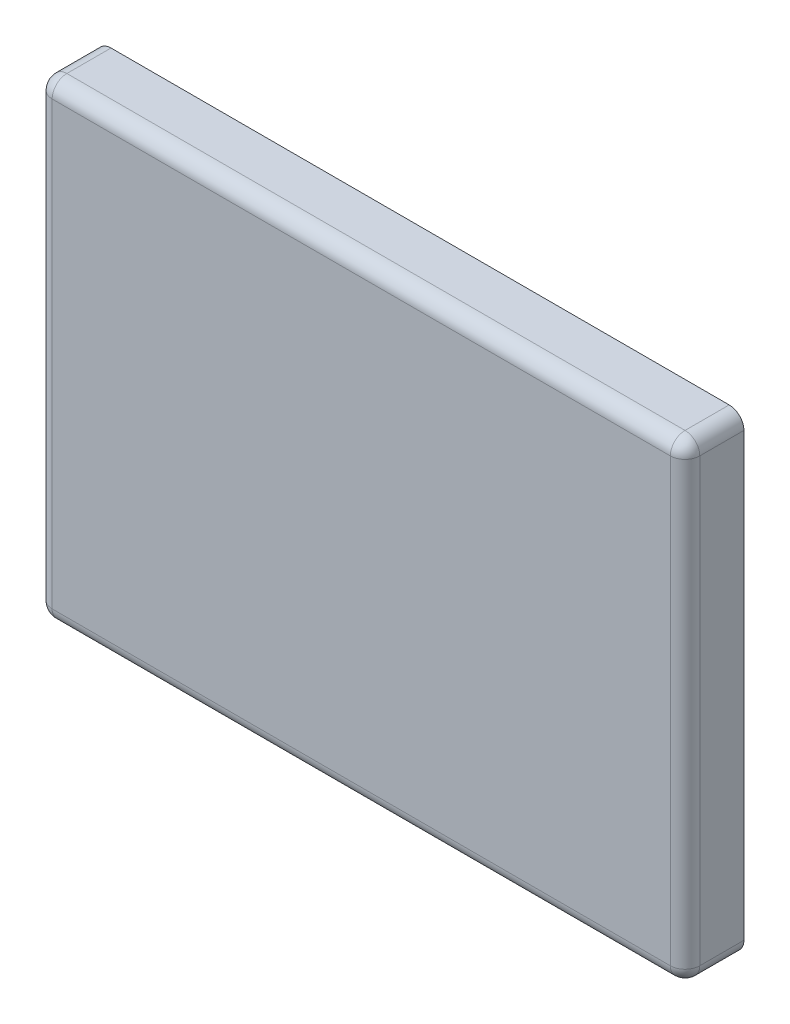
ISO-10303-21;
HEADER;
FILE_DESCRIPTION(('STEP AP214'),'2;1');
FILE_NAME('part.step','',(''),(''),'','','');
FILE_SCHEMA(('AUTOMOTIVE_DESIGN { 1 0 10303 214 1 1 1 1 }'));
ENDSEC;
DATA;
#1=APPLICATION_CONTEXT('core data for automotive mechanical design processes');
#2=APPLICATION_PROTOCOL_DEFINITION('international standard','automotive_design',2000,#1);
#3=PRODUCT_CONTEXT('',#1,'mechanical');
#4=PRODUCT('Part','Part','',(#3));
#5=PRODUCT_RELATED_PRODUCT_CATEGORY('part','',(#4));
#6=PRODUCT_DEFINITION_FORMATION('','',#4);
#7=PRODUCT_DEFINITION_CONTEXT('part definition',#1,'design');
#8=PRODUCT_DEFINITION('design','',#6,#7);
#9=PRODUCT_DEFINITION_SHAPE('','',#8);
#10=(LENGTH_UNIT() NAMED_UNIT(*) SI_UNIT(.MILLI.,.METRE.));
#11=(NAMED_UNIT(*) PLANE_ANGLE_UNIT() SI_UNIT($,.RADIAN.));
#12=(NAMED_UNIT(*) SI_UNIT($,.STERADIAN.) SOLID_ANGLE_UNIT());
#13=UNCERTAINTY_MEASURE_WITH_UNIT(LENGTH_MEASURE(1.E-05),#10,'distance_accuracy_value','');
#14=(GEOMETRIC_REPRESENTATION_CONTEXT(3) GLOBAL_UNCERTAINTY_ASSIGNED_CONTEXT((#13)) GLOBAL_UNIT_ASSIGNED_CONTEXT((#10,
#11,#12)) REPRESENTATION_CONTEXT('',''));
#15=CARTESIAN_POINT('',(0.,0.,0.));
#16=DIRECTION('',(0.,0.,1.));
#17=DIRECTION('',(1.,0.,0.));
#18=AXIS2_PLACEMENT_3D('',#15,#16,#17);
#19=CARTESIAN_POINT('',(0.,0.,0.));
#20=DIRECTION('',(0.,0.,1.));
#21=DIRECTION('',(1.,0.,0.));
#22=AXIS2_PLACEMENT_3D('',#19,#20,#21);
#23=PLANE('',#22);
#24=CARTESIAN_POINT('',(430.,-60.,0.));
#25=DIRECTION('',(0.,0.,-1.));
#26=DIRECTION('',(-1.,0.,0.));
#27=AXIS2_PLACEMENT_3D('',#24,#25,#26);
#28=CIRCLE('',#27,4.99999999999999);
#29=CARTESIAN_POINT('',(425.,-60.,0.));
#30=VERTEX_POINT('',#29);
#31=EDGE_CURVE('E494',#30,#30,#28,.T.);
#32=ORIENTED_EDGE('',*,*,#31,.F.);
#33=EDGE_LOOP('',(#32));
#34=FACE_BOUND('',#33,.T.);
#35=CARTESIAN_POINT('',(430.,-260.,0.));
#36=DIRECTION('',(0.,0.,-1.));
#37=DIRECTION('',(-1.,0.,0.));
#38=AXIS2_PLACEMENT_3D('',#35,#36,#37);
#39=CIRCLE('',#38,4.99999999999999);
#40=CARTESIAN_POINT('',(425.,-260.,0.));
#41=VERTEX_POINT('',#40);
#42=EDGE_CURVE('E501',#41,#41,#39,.T.);
#43=ORIENTED_EDGE('',*,*,#42,.F.);
#44=EDGE_LOOP('',(#43));
#45=FACE_BOUND('',#44,.T.);
#46=DIRECTION('',(1.,0.,0.));
#47=VECTOR('',#46,1.);
#48=CARTESIAN_POINT('',(0.,-320.,0.));
#49=LINE('',#48,#47);
#50=CARTESIAN_POINT('',(10.,-320.,0.));
#51=VERTEX_POINT('',#50);
#52=CARTESIAN_POINT('',(430.,-320.,0.));
#53=VERTEX_POINT('',#52);
#54=EDGE_CURVE('E185',#51,#53,#49,.T.);
#55=ORIENTED_EDGE('',*,*,#54,.F.);
#56=CARTESIAN_POINT('',(10.,-310.,0.));
#57=DIRECTION('',(0.,0.,1.));
#58=DIRECTION('',(1.,0.,0.));
#59=AXIS2_PLACEMENT_3D('',#56,#57,#58);
#60=CIRCLE('',#59,10.);
#61=CARTESIAN_POINT('',(0.,-310.,0.));
#62=VERTEX_POINT('',#61);
#63=EDGE_CURVE('E216',#51,#62,#60,.F.);
#64=ORIENTED_EDGE('',*,*,#63,.T.);
#65=DIRECTION('',(0.,-1.,0.));
#66=VECTOR('',#65,1.);
#67=CARTESIAN_POINT('',(0.,0.,0.));
#68=LINE('',#67,#66);
#69=CARTESIAN_POINT('',(0.,-10.,0.));
#70=VERTEX_POINT('',#69);
#71=EDGE_CURVE('E181',#70,#62,#68,.T.);
#72=ORIENTED_EDGE('',*,*,#71,.F.);
#73=CARTESIAN_POINT('',(10.,-10.,0.));
#74=DIRECTION('',(0.,0.,1.));
#75=DIRECTION('',(1.,0.,0.));
#76=AXIS2_PLACEMENT_3D('',#73,#74,#75);
#77=CIRCLE('',#76,10.);
#78=CARTESIAN_POINT('',(10.,0.,0.));
#79=VERTEX_POINT('',#78);
#80=EDGE_CURVE('E207',#70,#79,#77,.F.);
#81=ORIENTED_EDGE('',*,*,#80,.T.);
#82=DIRECTION('',(-1.,0.,0.));
#83=VECTOR('',#82,1.);
#84=CARTESIAN_POINT('',(0.,0.,0.));
#85=LINE('',#84,#83);
#86=CARTESIAN_POINT('',(430.,0.,0.));
#87=VERTEX_POINT('',#86);
#88=EDGE_CURVE('E193',#87,#79,#85,.T.);
#89=ORIENTED_EDGE('',*,*,#88,.F.);
#90=CARTESIAN_POINT('',(430.,-10.,0.));
#91=DIRECTION('',(0.,0.,1.));
#92=DIRECTION('',(1.,0.,0.));
#93=AXIS2_PLACEMENT_3D('',#90,#91,#92);
#94=CIRCLE('',#93,10.);
#95=CARTESIAN_POINT('',(440.,-10.,0.));
#96=VERTEX_POINT('',#95);
#97=EDGE_CURVE('E210',#87,#96,#94,.F.);
#98=ORIENTED_EDGE('',*,*,#97,.T.);
#99=DIRECTION('',(0.,1.,0.));
#100=VECTOR('',#99,1.);
#101=CARTESIAN_POINT('',(440.,0.,0.));
#102=LINE('',#101,#100);
#103=CARTESIAN_POINT('',(440.,-310.,0.));
#104=VERTEX_POINT('',#103);
#105=EDGE_CURVE('E189',#104,#96,#102,.T.);
#106=ORIENTED_EDGE('',*,*,#105,.F.);
#107=CARTESIAN_POINT('',(430.,-310.,0.));
#108=DIRECTION('',(0.,0.,1.));
#109=DIRECTION('',(1.,0.,0.));
#110=AXIS2_PLACEMENT_3D('',#107,#108,#109);
#111=CIRCLE('',#110,10.);
#112=EDGE_CURVE('E213',#104,#53,#111,.F.);
#113=ORIENTED_EDGE('',*,*,#112,.T.);
#114=EDGE_LOOP('',(#55,#64,#72,#81,#89,#98,#106,#113));
#115=FACE_BOUND('',#114,.T.);
#116=DIRECTION('',(0.,-1.,0.));
#117=VECTOR('',#116,1.);
#118=CARTESIAN_POINT('',(400.,-40.,0.));
#119=LINE('',#118,#117);
#120=CARTESIAN_POINT('',(400.,-40.,0.));
#121=VERTEX_POINT('',#120);
#122=CARTESIAN_POINT('',(400.,-280.,0.));
#123=VERTEX_POINT('',#122);
#124=EDGE_CURVE('E62',#121,#123,#119,.T.);
#125=ORIENTED_EDGE('',*,*,#124,.F.);
#126=DIRECTION('',(1.,0.,0.));
#127=VECTOR('',#126,1.);
#128=CARTESIAN_POINT('',(400.,-40.,0.));
#129=LINE('',#128,#127);
#130=CARTESIAN_POINT('',(40.,-40.,0.));
#131=VERTEX_POINT('',#130);
#132=EDGE_CURVE('E66',#131,#121,#129,.T.);
#133=ORIENTED_EDGE('',*,*,#132,.F.);
#134=DIRECTION('',(0.,1.,0.));
#135=VECTOR('',#134,1.);
#136=CARTESIAN_POINT('',(40.,-40.,0.));
#137=LINE('',#136,#135);
#138=CARTESIAN_POINT('',(39.9999999999999,-280.,0.));
#139=VERTEX_POINT('',#138);
#140=EDGE_CURVE('E518',#139,#131,#137,.T.);
#141=ORIENTED_EDGE('',*,*,#140,.F.);
#142=DIRECTION('',(-1.,0.,0.));
#143=VECTOR('',#142,1.);
#144=CARTESIAN_POINT('',(400.,-280.,0.));
#145=LINE('',#144,#143);
#146=EDGE_CURVE('E498',#123,#139,#145,.T.);
#147=ORIENTED_EDGE('',*,*,#146,.F.);
#148=EDGE_LOOP('',(#125,#133,#141,#147));
#149=FACE_BOUND('',#148,.T.);
#150=ADVANCED_FACE('F44',(#34,#45,#115,#149),#23,.F.);
#151=CARTESIAN_POINT('',(0.,0.,40.));
#152=DIRECTION('',(1.,0.,0.));
#153=DIRECTION('',(0.,1.,0.));
#154=AXIS2_PLACEMENT_3D('',#151,#152,#153);
#155=PLANE('',#154);
#156=ORIENTED_EDGE('',*,*,#71,.T.);
#157=DIRECTION('',(0.,0.,-1.));
#158=VECTOR('',#157,1.);
#159=CARTESIAN_POINT('',(0.,-310.,40.));
#160=LINE('',#159,#158);
#161=CARTESIAN_POINT('',(0.,-310.,30.));
#162=VERTEX_POINT('',#161);
#163=EDGE_CURVE('E225',#62,#162,#160,.F.);
#164=ORIENTED_EDGE('',*,*,#163,.T.);
#165=DIRECTION('',(0.,-1.,0.));
#166=VECTOR('',#165,1.);
#167=CARTESIAN_POINT('',(0.,0.,30.));
#168=LINE('',#167,#166);
#169=CARTESIAN_POINT('',(0.,-10.,30.));
#170=VERTEX_POINT('',#169);
#171=EDGE_CURVE('E222',#162,#170,#168,.F.);
#172=ORIENTED_EDGE('',*,*,#171,.T.);
#173=DIRECTION('',(0.,0.,-1.));
#174=VECTOR('',#173,1.);
#175=CARTESIAN_POINT('',(0.,-10.,40.));
#176=LINE('',#175,#174);
#177=EDGE_CURVE('E219',#170,#70,#176,.T.);
#178=ORIENTED_EDGE('',*,*,#177,.T.);
#179=EDGE_LOOP('',(#156,#164,#172,#178));
#180=FACE_BOUND('',#179,.T.);
#181=ADVANCED_FACE('F355',(#180),#155,.F.);
#182=CARTESIAN_POINT('',(0.,-320.,40.));
#183=DIRECTION('',(0.,1.,0.));
#184=DIRECTION('',(0.,0.,1.));
#185=AXIS2_PLACEMENT_3D('',#182,#183,#184);
#186=PLANE('',#185);
#187=DIRECTION('',(1.,0.,0.));
#188=VECTOR('',#187,1.);
#189=CARTESIAN_POINT('',(0.,-320.,30.));
#190=LINE('',#189,#188);
#191=CARTESIAN_POINT('',(430.,-320.,30.));
#192=VERTEX_POINT('',#191);
#193=CARTESIAN_POINT('',(10.,-320.,30.));
#194=VERTEX_POINT('',#193);
#195=EDGE_CURVE('E200',#192,#194,#190,.F.);
#196=ORIENTED_EDGE('',*,*,#195,.T.);
#197=DIRECTION('',(0.,0.,-1.));
#198=VECTOR('',#197,1.);
#199=CARTESIAN_POINT('',(10.,-320.,40.));
#200=LINE('',#199,#198);
#201=EDGE_CURVE('E203',#194,#51,#200,.T.);
#202=ORIENTED_EDGE('',*,*,#201,.T.);
#203=ORIENTED_EDGE('',*,*,#54,.T.);
#204=DIRECTION('',(0.,0.,-1.));
#205=VECTOR('',#204,1.);
#206=CARTESIAN_POINT('',(430.,-320.,40.));
#207=LINE('',#206,#205);
#208=EDGE_CURVE('E197',#53,#192,#207,.F.);
#209=ORIENTED_EDGE('',*,*,#208,.T.);
#210=EDGE_LOOP('',(#196,#202,#203,#209));
#211=FACE_BOUND('',#210,.T.);
#212=ADVANCED_FACE('F346',(#211),#186,.F.);
#213=CARTESIAN_POINT('',(440.,0.,40.));
#214=DIRECTION('',(-1.,0.,0.));
#215=DIRECTION('',(0.,-1.,0.));
#216=AXIS2_PLACEMENT_3D('',#213,#214,#215);
#217=PLANE('',#216);
#218=DIRECTION('',(0.,1.,0.));
#219=VECTOR('',#218,1.);
#220=CARTESIAN_POINT('',(440.,-320.,30.));
#221=LINE('',#220,#219);
#222=CARTESIAN_POINT('',(440.,-10.,30.));
#223=VERTEX_POINT('',#222);
#224=CARTESIAN_POINT('',(440.,-310.,30.));
#225=VERTEX_POINT('',#224);
#226=EDGE_CURVE('E244',#223,#225,#221,.F.);
#227=ORIENTED_EDGE('',*,*,#226,.T.);
#228=DIRECTION('',(0.,0.,-1.));
#229=VECTOR('',#228,1.);
#230=CARTESIAN_POINT('',(440.,-310.,40.));
#231=LINE('',#230,#229);
#232=EDGE_CURVE('E247',#225,#104,#231,.T.);
#233=ORIENTED_EDGE('',*,*,#232,.T.);
#234=ORIENTED_EDGE('',*,*,#105,.T.);
#235=DIRECTION('',(0.,0.,-1.));
#236=VECTOR('',#235,1.);
#237=CARTESIAN_POINT('',(440.,-10.,40.));
#238=LINE('',#237,#236);
#239=EDGE_CURVE('E241',#96,#223,#238,.F.);
#240=ORIENTED_EDGE('',*,*,#239,.T.);
#241=EDGE_LOOP('',(#227,#233,#234,#240));
#242=FACE_BOUND('',#241,.T.);
#243=ADVANCED_FACE('F338',(#242),#217,.F.);
#244=CARTESIAN_POINT('',(0.,0.,40.));
#245=DIRECTION('',(0.,-1.,0.));
#246=DIRECTION('',(0.,0.,-1.));
#247=AXIS2_PLACEMENT_3D('',#244,#245,#246);
#248=PLANE('',#247);
#249=DIRECTION('',(-1.,0.,0.));
#250=VECTOR('',#249,1.);
#251=CARTESIAN_POINT('',(440.,0.,30.));
#252=LINE('',#251,#250);
#253=CARTESIAN_POINT('',(10.,0.,30.));
#254=VERTEX_POINT('',#253);
#255=CARTESIAN_POINT('',(430.,0.,30.));
#256=VERTEX_POINT('',#255);
#257=EDGE_CURVE('E54',#254,#256,#252,.F.);
#258=ORIENTED_EDGE('',*,*,#257,.T.);
#259=DIRECTION('',(0.,0.,-1.));
#260=VECTOR('',#259,1.);
#261=CARTESIAN_POINT('',(430.,0.,40.));
#262=LINE('',#261,#260);
#263=EDGE_CURVE('E11',#256,#87,#262,.T.);
#264=ORIENTED_EDGE('',*,*,#263,.T.);
#265=ORIENTED_EDGE('',*,*,#88,.T.);
#266=DIRECTION('',(0.,0.,-1.));
#267=VECTOR('',#266,1.);
#268=CARTESIAN_POINT('',(10.,0.,40.));
#269=LINE('',#268,#267);
#270=EDGE_CURVE('E250',#79,#254,#269,.F.);
#271=ORIENTED_EDGE('',*,*,#270,.T.);
#272=EDGE_LOOP('',(#258,#264,#265,#271));
#273=FACE_BOUND('',#272,.T.);
#274=ADVANCED_FACE('F308',(#273),#248,.F.);
#275=CARTESIAN_POINT('',(0.,0.,40.));
#276=DIRECTION('',(0.,0.,1.));
#277=DIRECTION('',(1.,0.,0.));
#278=AXIS2_PLACEMENT_3D('',#275,#276,#277);
#279=PLANE('',#278);
#280=DIRECTION('',(-1.,0.,0.));
#281=VECTOR('',#280,1.);
#282=CARTESIAN_POINT('',(0.,-10.,40.));
#283=LINE('',#282,#281);
#284=CARTESIAN_POINT('',(430.,-10.,40.));
#285=VERTEX_POINT('',#284);
#286=CARTESIAN_POINT('',(10.,-10.,40.));
#287=VERTEX_POINT('',#286);
#288=EDGE_CURVE('E228',#285,#287,#283,.T.);
#289=ORIENTED_EDGE('',*,*,#288,.T.);
#290=DIRECTION('',(0.,-1.,0.));
#291=VECTOR('',#290,1.);
#292=CARTESIAN_POINT('',(10.,-320.,40.));
#293=LINE('',#292,#291);
#294=CARTESIAN_POINT('',(10.,-310.,40.));
#295=VERTEX_POINT('',#294);
#296=EDGE_CURVE('E237',#287,#295,#293,.T.);
#297=ORIENTED_EDGE('',*,*,#296,.T.);
#298=DIRECTION('',(1.,0.,0.));
#299=VECTOR('',#298,1.);
#300=CARTESIAN_POINT('',(440.,-310.,40.));
#301=LINE('',#300,#299);
#302=CARTESIAN_POINT('',(430.,-310.,40.));
#303=VERTEX_POINT('',#302);
#304=EDGE_CURVE('E234',#295,#303,#301,.T.);
#305=ORIENTED_EDGE('',*,*,#304,.T.);
#306=DIRECTION('',(0.,1.,0.));
#307=VECTOR('',#306,1.);
#308=CARTESIAN_POINT('',(430.,0.,40.));
#309=LINE('',#308,#307);
#310=EDGE_CURVE('E231',#303,#285,#309,.T.);
#311=ORIENTED_EDGE('',*,*,#310,.T.);
#312=EDGE_LOOP('',(#289,#297,#305,#311));
#313=FACE_BOUND('',#312,.T.);
#314=ADVANCED_FACE('F331',(#313),#279,.T.);
#315=CARTESIAN_POINT('',(430.,-10.,40.));
#316=DIRECTION('',(0.,0.,-1.));
#317=DIRECTION('',(-1.,0.,0.));
#318=AXIS2_PLACEMENT_3D('',#315,#316,#317);
#319=CYLINDRICAL_SURFACE('',#318,10.);
#320=CARTESIAN_POINT('',(430.,-10.,30.));
#321=DIRECTION('',(0.,0.,1.));
#322=DIRECTION('',(1.,0.,0.));
#323=AXIS2_PLACEMENT_3D('',#320,#321,#322);
#324=CIRCLE('',#323,10.);
#325=EDGE_CURVE('E48',#223,#256,#324,.T.);
#326=ORIENTED_EDGE('',*,*,#325,.F.);
#327=ORIENTED_EDGE('',*,*,#239,.F.);
#328=ORIENTED_EDGE('',*,*,#97,.F.);
#329=ORIENTED_EDGE('',*,*,#263,.F.);
#330=EDGE_LOOP('',(#326,#327,#328,#329));
#331=FACE_BOUND('',#330,.T.);
#332=ADVANCED_FACE('F46',(#331),#319,.T.);
#333=CARTESIAN_POINT('',(430.,-10.,30.));
#334=DIRECTION('',(0.,1.,0.));
#335=DIRECTION('',(0.,0.,1.));
#336=AXIS2_PLACEMENT_3D('',#333,#334,#335);
#337=SPHERICAL_SURFACE('',#336,10.);
#338=CARTESIAN_POINT('',(430.,-10.,30.));
#339=DIRECTION('',(0.,1.,0.));
#340=DIRECTION('',(-1.,0.,0.));
#341=AXIS2_PLACEMENT_3D('',#338,#339,#340);
#342=CIRCLE('',#341,10.);
#343=EDGE_CURVE('E285',#223,#285,#342,.F.);
#344=ORIENTED_EDGE('',*,*,#343,.F.);
#345=ORIENTED_EDGE('',*,*,#325,.T.);
#346=CARTESIAN_POINT('',(430.,-10.,30.));
#347=DIRECTION('',(1.,0.,0.));
#348=DIRECTION('',(0.,0.,-1.));
#349=AXIS2_PLACEMENT_3D('',#346,#347,#348);
#350=CIRCLE('',#349,10.);
#351=EDGE_CURVE('E288',#285,#256,#350,.F.);
#352=ORIENTED_EDGE('',*,*,#351,.F.);
#353=EDGE_LOOP('',(#344,#345,#352));
#354=FACE_BOUND('',#353,.T.);
#355=ADVANCED_FACE('F300',(#354),#337,.T.);
#356=CARTESIAN_POINT('',(10.,-10.,40.));
#357=DIRECTION('',(0.,0.,-1.));
#358=DIRECTION('',(-1.,0.,0.));
#359=AXIS2_PLACEMENT_3D('',#356,#357,#358);
#360=CYLINDRICAL_SURFACE('',#359,10.);
#361=ORIENTED_EDGE('',*,*,#80,.F.);
#362=ORIENTED_EDGE('',*,*,#177,.F.);
#363=CARTESIAN_POINT('',(10.,-10.,30.));
#364=DIRECTION('',(0.,0.,1.));
#365=DIRECTION('',(1.,0.,0.));
#366=AXIS2_PLACEMENT_3D('',#363,#364,#365);
#367=CIRCLE('',#366,10.);
#368=EDGE_CURVE('E281',#254,#170,#367,.T.);
#369=ORIENTED_EDGE('',*,*,#368,.F.);
#370=ORIENTED_EDGE('',*,*,#270,.F.);
#371=EDGE_LOOP('',(#361,#362,#369,#370));
#372=FACE_BOUND('',#371,.T.);
#373=ADVANCED_FACE('F317',(#372),#360,.T.);
#374=CARTESIAN_POINT('',(0.,-10.,30.));
#375=DIRECTION('',(1.,0.,0.));
#376=DIRECTION('',(0.,0.,-1.));
#377=AXIS2_PLACEMENT_3D('',#374,#375,#376);
#378=CYLINDRICAL_SURFACE('',#377,10.);
#379=ORIENTED_EDGE('',*,*,#351,.T.);
#380=ORIENTED_EDGE('',*,*,#257,.F.);
#381=CARTESIAN_POINT('',(10.,-10.,30.));
#382=DIRECTION('',(-1.,0.,0.));
#383=DIRECTION('',(0.,0.,1.));
#384=AXIS2_PLACEMENT_3D('',#381,#382,#383);
#385=CIRCLE('',#384,10.);
#386=EDGE_CURVE('E277',#287,#254,#385,.T.);
#387=ORIENTED_EDGE('',*,*,#386,.F.);
#388=ORIENTED_EDGE('',*,*,#288,.F.);
#389=EDGE_LOOP('',(#379,#380,#387,#388));
#390=FACE_BOUND('',#389,.T.);
#391=ADVANCED_FACE('F320',(#390),#378,.T.);
#392=CARTESIAN_POINT('',(430.,1.49186218934005E-13,30.));
#393=DIRECTION('',(0.,-1.,0.));
#394=DIRECTION('',(1.,0.,0.));
#395=AXIS2_PLACEMENT_3D('',#392,#393,#394);
#396=CYLINDRICAL_SURFACE('',#395,10.);
#397=ORIENTED_EDGE('',*,*,#343,.T.);
#398=ORIENTED_EDGE('',*,*,#310,.F.);
#399=CARTESIAN_POINT('',(430.,-310.,30.));
#400=DIRECTION('',(0.,-1.,0.));
#401=DIRECTION('',(0.,0.,-1.));
#402=AXIS2_PLACEMENT_3D('',#399,#400,#401);
#403=CIRCLE('',#402,10.);
#404=EDGE_CURVE('E273',#225,#303,#403,.T.);
#405=ORIENTED_EDGE('',*,*,#404,.F.);
#406=ORIENTED_EDGE('',*,*,#226,.F.);
#407=EDGE_LOOP('',(#397,#398,#405,#406));
#408=FACE_BOUND('',#407,.T.);
#409=ADVANCED_FACE('F335',(#408),#396,.T.);
#410=CARTESIAN_POINT('',(430.,-310.,40.));
#411=DIRECTION('',(0.,0.,-1.));
#412=DIRECTION('',(-1.,0.,0.));
#413=AXIS2_PLACEMENT_3D('',#410,#411,#412);
#414=CYLINDRICAL_SURFACE('',#413,10.);
#415=ORIENTED_EDGE('',*,*,#112,.F.);
#416=ORIENTED_EDGE('',*,*,#232,.F.);
#417=CARTESIAN_POINT('',(430.,-310.,30.));
#418=DIRECTION('',(0.,0.,1.));
#419=DIRECTION('',(1.,0.,0.));
#420=AXIS2_PLACEMENT_3D('',#417,#418,#419);
#421=CIRCLE('',#420,10.);
#422=EDGE_CURVE('E269',#192,#225,#421,.T.);
#423=ORIENTED_EDGE('',*,*,#422,.F.);
#424=ORIENTED_EDGE('',*,*,#208,.F.);
#425=EDGE_LOOP('',(#415,#416,#423,#424));
#426=FACE_BOUND('',#425,.T.);
#427=ADVANCED_FACE('F342',(#426),#414,.T.);
#428=CARTESIAN_POINT('',(10.,-10.,30.));
#429=DIRECTION('',(0.,1.,0.));
#430=DIRECTION('',(0.,0.,1.));
#431=AXIS2_PLACEMENT_3D('',#428,#429,#430);
#432=SPHERICAL_SURFACE('',#431,10.);
#433=ORIENTED_EDGE('',*,*,#386,.T.);
#434=ORIENTED_EDGE('',*,*,#368,.T.);
#435=CARTESIAN_POINT('',(10.,-10.,30.));
#436=DIRECTION('',(0.,1.,0.));
#437=DIRECTION('',(-1.,0.,0.));
#438=AXIS2_PLACEMENT_3D('',#435,#436,#437);
#439=CIRCLE('',#438,10.);
#440=EDGE_CURVE('E265',#287,#170,#439,.F.);
#441=ORIENTED_EDGE('',*,*,#440,.F.);
#442=EDGE_LOOP('',(#433,#434,#441));
#443=FACE_BOUND('',#442,.T.);
#444=ADVANCED_FACE('F324',(#443),#432,.T.);
#445=CARTESIAN_POINT('',(430.,-310.,30.));
#446=DIRECTION('',(1.,0.,0.));
#447=DIRECTION('',(0.,0.,-1.));
#448=AXIS2_PLACEMENT_3D('',#445,#446,#447);
#449=SPHERICAL_SURFACE('',#448,10.);
#450=ORIENTED_EDGE('',*,*,#422,.T.);
#451=ORIENTED_EDGE('',*,*,#404,.T.);
#452=CARTESIAN_POINT('',(430.,-310.,30.));
#453=DIRECTION('',(1.,0.,0.));
#454=DIRECTION('',(0.,0.,-1.));
#455=AXIS2_PLACEMENT_3D('',#452,#453,#454);
#456=CIRCLE('',#455,10.);
#457=EDGE_CURVE('E261',#192,#303,#456,.F.);
#458=ORIENTED_EDGE('',*,*,#457,.F.);
#459=EDGE_LOOP('',(#450,#451,#458));
#460=FACE_BOUND('',#459,.T.);
#461=ADVANCED_FACE('F361',(#460),#449,.T.);
#462=CARTESIAN_POINT('',(10.,0.,30.));
#463=DIRECTION('',(0.,1.,0.));
#464=DIRECTION('',(-1.,0.,0.));
#465=AXIS2_PLACEMENT_3D('',#462,#463,#464);
#466=CYLINDRICAL_SURFACE('',#465,10.);
#467=ORIENTED_EDGE('',*,*,#440,.T.);
#468=ORIENTED_EDGE('',*,*,#171,.F.);
#469=CARTESIAN_POINT('',(10.,-310.,30.));
#470=DIRECTION('',(0.,-1.,0.));
#471=DIRECTION('',(0.,0.,-1.));
#472=AXIS2_PLACEMENT_3D('',#469,#470,#471);
#473=CIRCLE('',#472,10.);
#474=EDGE_CURVE('E257',#295,#162,#473,.T.);
#475=ORIENTED_EDGE('',*,*,#474,.F.);
#476=ORIENTED_EDGE('',*,*,#296,.F.);
#477=EDGE_LOOP('',(#467,#468,#475,#476));
#478=FACE_BOUND('',#477,.T.);
#479=ADVANCED_FACE('F328',(#478),#466,.T.);
#480=CARTESIAN_POINT('',(0.,-310.,30.));
#481=DIRECTION('',(-1.,0.,0.));
#482=DIRECTION('',(0.,0.,1.));
#483=AXIS2_PLACEMENT_3D('',#480,#481,#482);
#484=CYLINDRICAL_SURFACE('',#483,10.);
#485=ORIENTED_EDGE('',*,*,#457,.T.);
#486=ORIENTED_EDGE('',*,*,#304,.F.);
#487=CARTESIAN_POINT('',(10.,-310.,30.));
#488=DIRECTION('',(-1.,0.,0.));
#489=DIRECTION('',(0.,0.,1.));
#490=AXIS2_PLACEMENT_3D('',#487,#488,#489);
#491=CIRCLE('',#490,10.);
#492=EDGE_CURVE('E175',#194,#295,#491,.T.);
#493=ORIENTED_EDGE('',*,*,#492,.F.);
#494=ORIENTED_EDGE('',*,*,#195,.F.);
#495=EDGE_LOOP('',(#485,#486,#493,#494));
#496=FACE_BOUND('',#495,.T.);
#497=ADVANCED_FACE('F359',(#496),#484,.T.);
#498=CARTESIAN_POINT('',(10.,-310.,30.));
#499=DIRECTION('',(0.,0.,1.));
#500=DIRECTION('',(1.,0.,0.));
#501=AXIS2_PLACEMENT_3D('',#498,#499,#500);
#502=SPHERICAL_SURFACE('',#501,10.);
#503=ORIENTED_EDGE('',*,*,#492,.T.);
#504=ORIENTED_EDGE('',*,*,#474,.T.);
#505=CARTESIAN_POINT('',(10.,-310.,30.));
#506=DIRECTION('',(0.,0.,1.));
#507=DIRECTION('',(1.,0.,0.));
#508=AXIS2_PLACEMENT_3D('',#505,#506,#507);
#509=CIRCLE('',#508,10.);
#510=EDGE_CURVE('E170',#194,#162,#509,.F.);
#511=ORIENTED_EDGE('',*,*,#510,.F.);
#512=EDGE_LOOP('',(#503,#504,#511));
#513=FACE_BOUND('',#512,.T.);
#514=ADVANCED_FACE('F357',(#513),#502,.T.);
#515=CARTESIAN_POINT('',(10.,-310.,40.));
#516=DIRECTION('',(0.,0.,-1.));
#517=DIRECTION('',(-1.,0.,0.));
#518=AXIS2_PLACEMENT_3D('',#515,#516,#517);
#519=CYLINDRICAL_SURFACE('',#518,10.);
#520=ORIENTED_EDGE('',*,*,#510,.T.);
#521=ORIENTED_EDGE('',*,*,#163,.F.);
#522=ORIENTED_EDGE('',*,*,#63,.F.);
#523=ORIENTED_EDGE('',*,*,#201,.F.);
#524=EDGE_LOOP('',(#520,#521,#522,#523));
#525=FACE_BOUND('',#524,.T.);
#526=ADVANCED_FACE('F351',(#525),#519,.T.);
#527=CARTESIAN_POINT('',(400.,-40.,-20.));
#528=DIRECTION('',(-1.,0.,0.));
#529=DIRECTION('',(0.,-1.,0.));
#530=AXIS2_PLACEMENT_3D('',#527,#528,#529);
#531=PLANE('',#530);
#532=ORIENTED_EDGE('',*,*,#124,.T.);
#533=DIRECTION('',(0.,0.,1.));
#534=VECTOR('',#533,1.);
#535=CARTESIAN_POINT('',(400.,-280.,-20.));
#536=LINE('',#535,#534);
#537=CARTESIAN_POINT('',(400.,-280.,-20.));
#538=VERTEX_POINT('',#537);
#539=EDGE_CURVE('E150',#538,#123,#536,.T.);
#540=ORIENTED_EDGE('',*,*,#539,.F.);
#541=DIRECTION('',(0.,-1.,0.));
#542=VECTOR('',#541,1.);
#543=CARTESIAN_POINT('',(400.,-40.,-20.));
#544=LINE('',#543,#542);
#545=CARTESIAN_POINT('',(400.,-40.,-20.));
#546=VERTEX_POINT('',#545);
#547=EDGE_CURVE('E157',#546,#538,#544,.T.);
#548=ORIENTED_EDGE('',*,*,#547,.F.);
#549=DIRECTION('',(0.,0.,1.));
#550=VECTOR('',#549,1.);
#551=CARTESIAN_POINT('',(400.,-40.,-20.));
#552=LINE('',#551,#550);
#553=EDGE_CURVE('E514',#546,#121,#552,.T.);
#554=ORIENTED_EDGE('',*,*,#553,.T.);
#555=EDGE_LOOP('',(#532,#540,#548,#554));
#556=FACE_BOUND('',#555,.T.);
#557=ADVANCED_FACE('F168',(#556),#531,.F.);
#558=CARTESIAN_POINT('',(400.,-280.,-20.));
#559=DIRECTION('',(0.,1.,0.));
#560=DIRECTION('',(0.,0.,1.));
#561=AXIS2_PLACEMENT_3D('',#558,#559,#560);
#562=PLANE('',#561);
#563=ORIENTED_EDGE('',*,*,#146,.T.);
#564=DIRECTION('',(0.,0.,1.));
#565=VECTOR('',#564,1.);
#566=CARTESIAN_POINT('',(39.9999999999999,-280.,-20.));
#567=LINE('',#566,#565);
#568=CARTESIAN_POINT('',(39.9999999999999,-280.,-20.));
#569=VERTEX_POINT('',#568);
#570=EDGE_CURVE('E152',#569,#139,#567,.T.);
#571=ORIENTED_EDGE('',*,*,#570,.F.);
#572=DIRECTION('',(-1.,0.,0.));
#573=VECTOR('',#572,1.);
#574=CARTESIAN_POINT('',(400.,-280.,-20.));
#575=LINE('',#574,#573);
#576=EDGE_CURVE('E145',#538,#569,#575,.T.);
#577=ORIENTED_EDGE('',*,*,#576,.F.);
#578=ORIENTED_EDGE('',*,*,#539,.T.);
#579=EDGE_LOOP('',(#563,#571,#577,#578));
#580=FACE_BOUND('',#579,.T.);
#581=ADVANCED_FACE('F148',(#580),#562,.F.);
#582=CARTESIAN_POINT('',(40.,-40.,-20.));
#583=DIRECTION('',(1.,0.,0.));
#584=DIRECTION('',(0.,1.,0.));
#585=AXIS2_PLACEMENT_3D('',#582,#583,#584);
#586=PLANE('',#585);
#587=ORIENTED_EDGE('',*,*,#140,.T.);
#588=DIRECTION('',(0.,0.,1.));
#589=VECTOR('',#588,1.);
#590=CARTESIAN_POINT('',(40.,-40.,-20.));
#591=LINE('',#590,#589);
#592=CARTESIAN_POINT('',(40.,-40.,-20.));
#593=VERTEX_POINT('',#592);
#594=EDGE_CURVE('E177',#593,#131,#591,.T.);
#595=ORIENTED_EDGE('',*,*,#594,.F.);
#596=DIRECTION('',(0.,1.,0.));
#597=VECTOR('',#596,1.);
#598=CARTESIAN_POINT('',(40.,-40.,-20.));
#599=LINE('',#598,#597);
#600=EDGE_CURVE('E156',#569,#593,#599,.T.);
#601=ORIENTED_EDGE('',*,*,#600,.F.);
#602=ORIENTED_EDGE('',*,*,#570,.T.);
#603=EDGE_LOOP('',(#587,#595,#601,#602));
#604=FACE_BOUND('',#603,.T.);
#605=ADVANCED_FACE('F423',(#604),#586,.F.);
#606=CARTESIAN_POINT('',(400.,-40.,-20.));
#607=DIRECTION('',(0.,-1.,0.));
#608=DIRECTION('',(1.,0.,0.));
#609=AXIS2_PLACEMENT_3D('',#606,#607,#608);
#610=PLANE('',#609);
#611=ORIENTED_EDGE('',*,*,#132,.T.);
#612=ORIENTED_EDGE('',*,*,#553,.F.);
#613=DIRECTION('',(1.,0.,0.));
#614=VECTOR('',#613,1.);
#615=CARTESIAN_POINT('',(400.,-40.,-20.));
#616=LINE('',#615,#614);
#617=EDGE_CURVE('E162',#593,#546,#616,.T.);
#618=ORIENTED_EDGE('',*,*,#617,.F.);
#619=ORIENTED_EDGE('',*,*,#594,.T.);
#620=EDGE_LOOP('',(#611,#612,#618,#619));
#621=FACE_BOUND('',#620,.T.);
#622=ADVANCED_FACE('F431',(#621),#610,.F.);
#623=CARTESIAN_POINT('',(0.,0.,-20.));
#624=DIRECTION('',(0.,0.,-1.));
#625=DIRECTION('',(-1.,0.,0.));
#626=AXIS2_PLACEMENT_3D('',#623,#624,#625);
#627=PLANE('',#626);
#628=ORIENTED_EDGE('',*,*,#547,.T.);
#629=ORIENTED_EDGE('',*,*,#576,.T.);
#630=ORIENTED_EDGE('',*,*,#600,.T.);
#631=ORIENTED_EDGE('',*,*,#617,.T.);
#632=EDGE_LOOP('',(#628,#629,#630,#631));
#633=FACE_BOUND('',#632,.T.);
#634=ADVANCED_FACE('F160',(#633),#627,.T.);
#635=CARTESIAN_POINT('',(430.,-260.,10.));
#636=DIRECTION('',(0.,0.,-1.));
#637=DIRECTION('',(-1.,0.,0.));
#638=AXIS2_PLACEMENT_3D('',#635,#636,#637);
#639=CYLINDRICAL_SURFACE('',#638,4.99999999999999);
#640=CARTESIAN_POINT('',(430.,-260.,10.));
#641=DIRECTION('',(0.,0.,-1.));
#642=DIRECTION('',(-1.,0.,0.));
#643=AXIS2_PLACEMENT_3D('',#640,#641,#642);
#644=CIRCLE('',#643,4.99999999999999);
#645=CARTESIAN_POINT('',(425.,-260.,10.));
#646=VERTEX_POINT('',#645);
#647=EDGE_CURVE('E507',#646,#646,#644,.T.);
#648=ORIENTED_EDGE('',*,*,#647,.F.);
#649=EDGE_LOOP('',(#648));
#650=FACE_BOUND('',#649,.T.);
#651=ORIENTED_EDGE('',*,*,#42,.T.);
#652=EDGE_LOOP('',(#651));
#653=FACE_BOUND('',#652,.T.);
#654=ADVANCED_FACE('F446',(#650,#653),#639,.F.);
#655=CARTESIAN_POINT('',(430.,-260.,10.));
#656=DIRECTION('',(0.,0.,-1.));
#657=DIRECTION('',(-1.,0.,0.));
#658=AXIS2_PLACEMENT_3D('',#655,#656,#657);
#659=PLANE('',#658);
#660=ORIENTED_EDGE('',*,*,#647,.T.);
#661=EDGE_LOOP('',(#660));
#662=FACE_BOUND('',#661,.T.);
#663=ADVANCED_FACE('F457',(#662),#659,.T.);
#664=CARTESIAN_POINT('',(430.,-60.,10.));
#665=DIRECTION('',(0.,0.,-1.));
#666=DIRECTION('',(-1.,0.,0.));
#667=AXIS2_PLACEMENT_3D('',#664,#665,#666);
#668=CYLINDRICAL_SURFACE('',#667,4.99999999999999);
#669=CARTESIAN_POINT('',(430.,-60.,10.));
#670=DIRECTION('',(0.,0.,-1.));
#671=DIRECTION('',(-1.,0.,0.));
#672=AXIS2_PLACEMENT_3D('',#669,#670,#671);
#673=CIRCLE('',#672,4.99999999999999);
#674=CARTESIAN_POINT('',(425.,-60.,10.));
#675=VERTEX_POINT('',#674);
#676=EDGE_CURVE('E492',#675,#675,#673,.T.);
#677=ORIENTED_EDGE('',*,*,#676,.F.);
#678=EDGE_LOOP('',(#677));
#679=FACE_BOUND('',#678,.T.);
#680=ORIENTED_EDGE('',*,*,#31,.T.);
#681=EDGE_LOOP('',(#680));
#682=FACE_BOUND('',#681,.T.);
#683=ADVANCED_FACE('F467',(#679,#682),#668,.F.);
#684=CARTESIAN_POINT('',(430.,-60.,10.));
#685=DIRECTION('',(0.,0.,-1.));
#686=DIRECTION('',(-1.,0.,0.));
#687=AXIS2_PLACEMENT_3D('',#684,#685,#686);
#688=PLANE('',#687);
#689=ORIENTED_EDGE('',*,*,#676,.T.);
#690=EDGE_LOOP('',(#689));
#691=FACE_BOUND('',#690,.T.);
#692=ADVANCED_FACE('F477',(#691),#688,.T.);
#693=CLOSED_SHELL('',(#150,#181,#212,#243,#274,#314,#332,#355,#373,#391,#409,#427,#444,#461,
#479,#497,#514,#526,#557,#581,#605,#622,#634,#654,#663,#683,#692));
#694=MANIFOLD_SOLID_BREP('B2',#693);
#695=ADVANCED_BREP_SHAPE_REPRESENTATION('',(#18,#694),#14);
#696=SHAPE_DEFINITION_REPRESENTATION(#9,#695);
ENDSEC;
END-ISO-10303-21;
